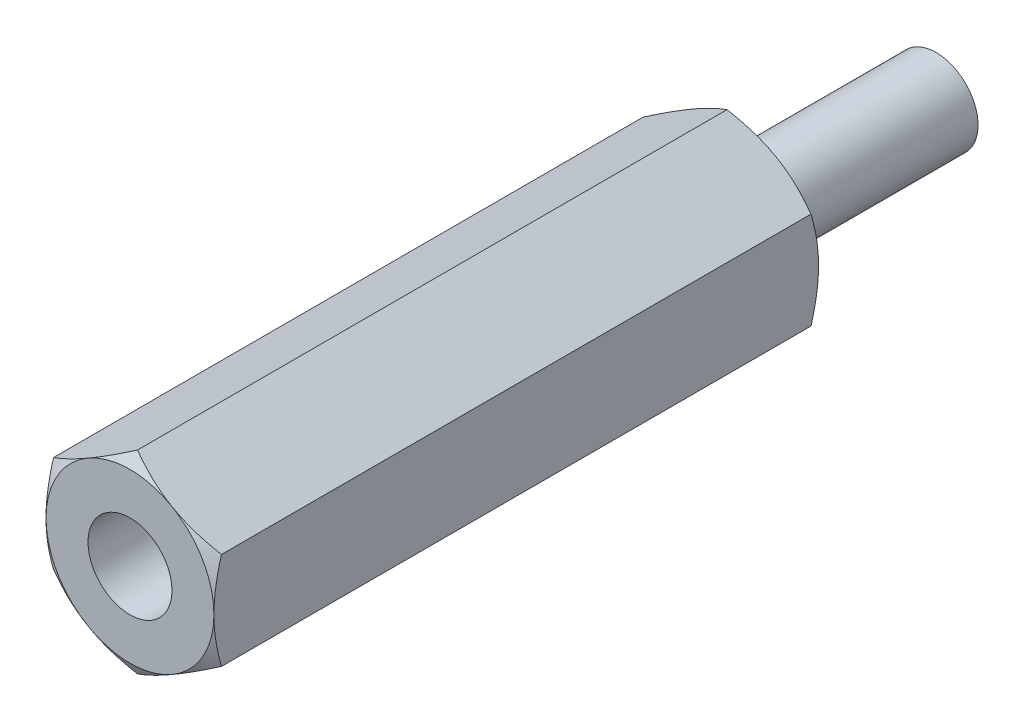
ISO-10303-21;
HEADER;
FILE_DESCRIPTION(('STEP AP214'),'2;1');
FILE_NAME('part.step','',(''),(''),'','','');
FILE_SCHEMA(('AUTOMOTIVE_DESIGN { 1 0 10303 214 1 1 1 1 }'));
ENDSEC;
DATA;
#1=APPLICATION_CONTEXT('core data for automotive mechanical design processes');
#2=APPLICATION_PROTOCOL_DEFINITION('international standard','automotive_design',2000,#1);
#3=PRODUCT_CONTEXT('',#1,'mechanical');
#4=PRODUCT('Part','Part','',(#3));
#5=PRODUCT_RELATED_PRODUCT_CATEGORY('part','',(#4));
#6=PRODUCT_DEFINITION_FORMATION('','',#4);
#7=PRODUCT_DEFINITION_CONTEXT('part definition',#1,'design');
#8=PRODUCT_DEFINITION('design','',#6,#7);
#9=PRODUCT_DEFINITION_SHAPE('','',#8);
#10=(LENGTH_UNIT() NAMED_UNIT(*) SI_UNIT(.MILLI.,.METRE.));
#11=(NAMED_UNIT(*) PLANE_ANGLE_UNIT() SI_UNIT($,.RADIAN.));
#12=(NAMED_UNIT(*) SI_UNIT($,.STERADIAN.) SOLID_ANGLE_UNIT());
#13=UNCERTAINTY_MEASURE_WITH_UNIT(LENGTH_MEASURE(1.E-05),#10,'distance_accuracy_value','');
#14=(GEOMETRIC_REPRESENTATION_CONTEXT(3) GLOBAL_UNCERTAINTY_ASSIGNED_CONTEXT((#13)) GLOBAL_UNIT_ASSIGNED_CONTEXT((#10,
#11,#12)) REPRESENTATION_CONTEXT('',''));
#15=CARTESIAN_POINT('',(0.,0.,0.));
#16=DIRECTION('',(0.,0.,1.));
#17=DIRECTION('',(1.,0.,0.));
#18=AXIS2_PLACEMENT_3D('',#15,#16,#17);
#19=CARTESIAN_POINT('',(0.,0.,9.));
#20=DIRECTION('',(0.,0.,1.));
#21=DIRECTION('',(1.,0.,0.));
#22=AXIS2_PLACEMENT_3D('',#19,#20,#21);
#23=PLANE('',#22);
#24=CARTESIAN_POINT('',(0.,0.,9.));
#25=DIRECTION('',(0.,0.,-1.));
#26=DIRECTION('',(1.,0.,0.));
#27=AXIS2_PLACEMENT_3D('',#24,#25,#26);
#28=CIRCLE('',#27,1.25);
#29=CARTESIAN_POINT('',(-1.25,0.,9.));
#30=VERTEX_POINT('',#29);
#31=EDGE_CURVE('P0_E238',#30,#30,#28,.T.);
#32=ORIENTED_EDGE('',*,*,#31,.T.);
#33=EDGE_LOOP('',(#32));
#34=FACE_BOUND('',#33,.T.);
#35=CARTESIAN_POINT('',(0.,0.,9.));
#36=DIRECTION('',(0.,0.,1.));
#37=DIRECTION('',(0.,1.,0.));
#38=AXIS2_PLACEMENT_3D('',#35,#36,#37);
#39=CIRCLE('',#38,2.5);
#40=CARTESIAN_POINT('',(1.25,2.1650635094611,9.));
#41=VERTEX_POINT('',#40);
#42=CARTESIAN_POINT('',(-1.25,2.1650635094611,9.));
#43=VERTEX_POINT('',#42);
#44=EDGE_CURVE('P0_E236',#41,#43,#39,.T.);
#45=ORIENTED_EDGE('',*,*,#44,.T.);
#46=CARTESIAN_POINT('',(0.,0.,9.));
#47=DIRECTION('',(0.,0.,1.));
#48=DIRECTION('',(0.,1.,0.));
#49=AXIS2_PLACEMENT_3D('',#46,#47,#48);
#50=CIRCLE('',#49,2.5);
#51=CARTESIAN_POINT('',(-2.5,0.,9.));
#52=VERTEX_POINT('',#51);
#53=EDGE_CURVE('P0_E180',#43,#52,#50,.T.);
#54=ORIENTED_EDGE('',*,*,#53,.T.);
#55=CARTESIAN_POINT('',(0.,0.,9.));
#56=DIRECTION('',(0.,0.,1.));
#57=DIRECTION('',(0.,1.,0.));
#58=AXIS2_PLACEMENT_3D('',#55,#56,#57);
#59=CIRCLE('',#58,2.5);
#60=CARTESIAN_POINT('',(-1.25,-2.1650635094611,9.));
#61=VERTEX_POINT('',#60);
#62=EDGE_CURVE('P0_E175',#52,#61,#59,.T.);
#63=ORIENTED_EDGE('',*,*,#62,.T.);
#64=CARTESIAN_POINT('',(0.,0.,9.));
#65=DIRECTION('',(0.,0.,1.));
#66=DIRECTION('',(0.,1.,0.));
#67=AXIS2_PLACEMENT_3D('',#64,#65,#66);
#68=CIRCLE('',#67,2.5);
#69=CARTESIAN_POINT('',(1.25,-2.1650635094611,9.));
#70=VERTEX_POINT('',#69);
#71=EDGE_CURVE('P0_E173',#61,#70,#68,.T.);
#72=ORIENTED_EDGE('',*,*,#71,.T.);
#73=CARTESIAN_POINT('',(0.,0.,9.));
#74=DIRECTION('',(0.,0.,1.));
#75=DIRECTION('',(0.,1.,0.));
#76=AXIS2_PLACEMENT_3D('',#73,#74,#75);
#77=CIRCLE('',#76,2.5);
#78=CARTESIAN_POINT('',(2.5,0.,9.));
#79=VERTEX_POINT('',#78);
#80=EDGE_CURVE('P0_E174',#70,#79,#77,.T.);
#81=ORIENTED_EDGE('',*,*,#80,.T.);
#82=CARTESIAN_POINT('',(0.,0.,9.));
#83=DIRECTION('',(0.,0.,1.));
#84=DIRECTION('',(0.,1.,0.));
#85=AXIS2_PLACEMENT_3D('',#82,#83,#84);
#86=CIRCLE('',#85,2.5);
#87=EDGE_CURVE('P0_E243',#79,#41,#86,.T.);
#88=ORIENTED_EDGE('',*,*,#87,.T.);
#89=EDGE_LOOP('',(#45,#54,#63,#72,#81,#88));
#90=FACE_BOUND('',#89,.T.);
#91=ADVANCED_FACE('P0_F17',(#34,#90),#23,.T.);
#92=CARTESIAN_POINT('',(-2.5,-1.44337567297406,0.));
#93=DIRECTION('',(-0.5,-0.866025403784439,0.));
#94=DIRECTION('',(-0.866025403784439,0.5,0.));
#95=AXIS2_PLACEMENT_3D('',#92,#93,#94);
#96=PLANE('',#95);
#97=CARTESIAN_POINT('',(-1.25,-2.1650635094611,-9.));
#98=CARTESIAN_POINT('',(-1.83012701892219,-1.83012701892219,-9.));
#99=CARTESIAN_POINT('',(-2.5,-1.44337567297406,-8.7767090063074));
#100=(BOUNDED_CURVE() B_SPLINE_CURVE(2,(#97,#98,#99),.UNSPECIFIED.,.F.,
.F.) B_SPLINE_CURVE_WITH_KNOTS((3,3),(0.736177037307537,0.963660383345878),
.UNSPECIFIED.) CURVE() GEOMETRIC_REPRESENTATION_ITEM() RATIONAL_B_SPLINE_CURVE((1.,
1.12214587875236,1.16880406420473)) REPRESENTATION_ITEM(''));
#101=CARTESIAN_POINT('',(-1.25,-2.1650635094611,-9.));
#102=VERTEX_POINT('',#101);
#103=CARTESIAN_POINT('',(-2.5,-1.44337567297406,-8.7767090063074));
#104=VERTEX_POINT('',#103);
#105=EDGE_CURVE('P0_E283',#102,#104,#100,.T.);
#106=ORIENTED_EDGE('',*,*,#105,.F.);
#107=CARTESIAN_POINT('',(0.,-2.88675134594813,-8.7767090063074));
#108=CARTESIAN_POINT('',(-0.669872981077806,-2.5,-9.));
#109=CARTESIAN_POINT('',(-1.25,-2.1650635094611,-9.));
#110=(BOUNDED_CURVE() B_SPLINE_CURVE(2,(#107,#108,#109),.UNSPECIFIED.,.F.,
.F.) B_SPLINE_CURVE_WITH_KNOTS((3,3),(0.527256351654248,0.757443789995707),
.UNSPECIFIED.) CURVE() GEOMETRIC_REPRESENTATION_ITEM() RATIONAL_B_SPLINE_CURVE((1.17255857963456,
1.12394675203494,1.)) REPRESENTATION_ITEM(''));
#111=CARTESIAN_POINT('',(0.,-2.88675134594813,-8.7767090063074));
#112=VERTEX_POINT('',#111);
#113=EDGE_CURVE('P0_E288',#112,#102,#110,.T.);
#114=ORIENTED_EDGE('',*,*,#113,.F.);
#115=DIRECTION('',(0.,0.,1.));
#116=VECTOR('',#115,1.);
#117=CARTESIAN_POINT('',(0.,-2.88675134594813,0.));
#118=LINE('',#117,#116);
#119=CARTESIAN_POINT('',(0.,-2.88675134594813,8.7767090063074));
#120=VERTEX_POINT('',#119);
#121=EDGE_CURVE('P0_E20',#112,#120,#118,.T.);
#122=ORIENTED_EDGE('',*,*,#121,.T.);
#123=CARTESIAN_POINT('',(0.,-2.88675134594813,8.7767090063074));
#124=CARTESIAN_POINT('',(-0.669872981076414,-2.5000000000008,8.99999999999922));
#125=CARTESIAN_POINT('',(-1.25,-2.1650635094611,9.));
#126=(BOUNDED_CURVE() B_SPLINE_CURVE(2,(#123,#124,#125),.UNSPECIFIED.,.F.,
.F.) B_SPLINE_CURVE_WITH_KNOTS((3,3),(0.658510081069826,0.907146244987517),
.UNSPECIFIED.) CURVE() GEOMETRIC_REPRESENTATION_ITEM() RATIONAL_B_SPLINE_CURVE((1.19657732070712,
1.13539988487303,1.)) REPRESENTATION_ITEM(''));
#127=EDGE_CURVE('P0_E164',#120,#61,#126,.T.);
#128=ORIENTED_EDGE('',*,*,#127,.T.);
#129=CARTESIAN_POINT('',(-1.25,-2.1650635094611,9.));
#130=CARTESIAN_POINT('',(-1.83012701892359,-1.83012701892139,8.99999999999922));
#131=CARTESIAN_POINT('',(-2.5,-1.44337567297406,8.7767090063074));
#132=(BOUNDED_CURVE() B_SPLINE_CURVE(2,(#129,#130,#131),.UNSPECIFIED.,.F.,
.F.) B_SPLINE_CURVE_WITH_KNOTS((3,3),(0.907146244987517,1.15578240890521),
.UNSPECIFIED.) CURVE() GEOMETRIC_REPRESENTATION_ITEM() RATIONAL_B_SPLINE_CURVE((1.,
1.13539988487303,1.19657732070712)) REPRESENTATION_ITEM(''));
#133=CARTESIAN_POINT('',(-2.5,-1.44337567297406,8.7767090063074));
#134=VERTEX_POINT('',#133);
#135=EDGE_CURVE('P0_E181',#61,#134,#132,.T.);
#136=ORIENTED_EDGE('',*,*,#135,.T.);
#137=DIRECTION('',(0.,0.,1.));
#138=VECTOR('',#137,1.);
#139=CARTESIAN_POINT('',(-2.5,-1.44337567297406,0.));
#140=LINE('',#139,#138);
#141=EDGE_CURVE('P0_E294',#104,#134,#140,.T.);
#142=ORIENTED_EDGE('',*,*,#141,.F.);
#143=EDGE_LOOP('',(#106,#114,#122,#128,#136,#142));
#144=FACE_BOUND('',#143,.T.);
#145=ADVANCED_FACE('P0_F473',(#144),#96,.T.);
#146=CARTESIAN_POINT('',(0.,0.,-1.));
#147=DIRECTION('',(0.,0.,1.));
#148=DIRECTION('',(1.,0.,0.));
#149=AXIS2_PLACEMENT_3D('',#146,#147,#148);
#150=PLANE('',#149);
#151=CARTESIAN_POINT('',(0.,0.,-1.));
#152=DIRECTION('',(0.,0.,-1.));
#153=DIRECTION('',(1.,0.,0.));
#154=AXIS2_PLACEMENT_3D('',#151,#152,#153);
#155=CIRCLE('',#154,1.25);
#156=CARTESIAN_POINT('',(-1.25,0.,-1.));
#157=VERTEX_POINT('',#156);
#158=EDGE_CURVE('P0_E11',#157,#157,#155,.T.);
#159=ORIENTED_EDGE('',*,*,#158,.F.);
#160=EDGE_LOOP('',(#159));
#161=FACE_BOUND('',#160,.T.);
#162=ADVANCED_FACE('P0_F546',(#161),#150,.T.);
#163=CARTESIAN_POINT('',(0.,0.,9.));
#164=DIRECTION('',(0.,0.,-1.));
#165=DIRECTION('',(1.,0.,0.));
#166=AXIS2_PLACEMENT_3D('',#163,#164,#165);
#167=CYLINDRICAL_SURFACE('',#166,1.25);
#168=ORIENTED_EDGE('',*,*,#31,.F.);
#169=DIRECTION('',(0.,0.,-1.));
#170=VECTOR('',#169,1.);
#171=CARTESIAN_POINT('',(-1.25,0.,9.));
#172=LINE('',#171,#170);
#173=EDGE_CURVE('P0_E27',#30,#157,#172,.T.);
#174=ORIENTED_EDGE('',*,*,#173,.T.);
#175=ORIENTED_EDGE('',*,*,#158,.T.);
#176=ORIENTED_EDGE('',*,*,#173,.F.);
#177=EDGE_LOOP('',(#168,#174,#175,#176));
#178=FACE_BOUND('',#177,.T.);
#179=ADVANCED_FACE('P0_F549',(#178),#167,.F.);
#180=CARTESIAN_POINT('',(0.,0.,7.22168783648703));
#181=DIRECTION('',(0.,0.,-1.));
#182=DIRECTION('',(0.,1.,0.));
#183=AXIS2_PLACEMENT_3D('',#180,#181,#182);
#184=CONICAL_SURFACE('',#183,5.58012701892219,1.0471975511966);
#185=CARTESIAN_POINT('',(-1.25,2.1650635094611,9.));
#186=CARTESIAN_POINT('',(-0.669872981076411,2.50000000000081,8.99999999999922));
#187=CARTESIAN_POINT('',(0.,2.88675134594813,8.7767090063074));
#188=(BOUNDED_CURVE() B_SPLINE_CURVE(2,(#185,#186,#187),.UNSPECIFIED.,.F.,
.F.) B_SPLINE_CURVE_WITH_KNOTS((3,3),(0.907146244987517,1.15578240890521),
.UNSPECIFIED.) CURVE() GEOMETRIC_REPRESENTATION_ITEM() RATIONAL_B_SPLINE_CURVE((1.,
1.13539988487303,1.19657732070712)) REPRESENTATION_ITEM(''));
#189=CARTESIAN_POINT('',(0.,2.88675134594813,8.7767090063074));
#190=VERTEX_POINT('',#189);
#191=EDGE_CURVE('P0_E187',#43,#190,#188,.T.);
#192=ORIENTED_EDGE('',*,*,#191,.F.);
#193=ORIENTED_EDGE('',*,*,#44,.F.);
#194=CARTESIAN_POINT('',(0.,2.88675134594813,8.7767090063074));
#195=CARTESIAN_POINT('',(0.669872981076414,2.5000000000008,8.99999999999922));
#196=CARTESIAN_POINT('',(1.25,2.1650635094611,9.));
#197=(BOUNDED_CURVE() B_SPLINE_CURVE(2,(#194,#195,#196),.UNSPECIFIED.,.F.,
.F.) B_SPLINE_CURVE_WITH_KNOTS((3,3),(0.658510081069826,0.907146244987517),
.UNSPECIFIED.) CURVE() GEOMETRIC_REPRESENTATION_ITEM() RATIONAL_B_SPLINE_CURVE((1.19657732070712,
1.13539988487303,1.)) REPRESENTATION_ITEM(''));
#198=EDGE_CURVE('P0_E252',#190,#41,#197,.T.);
#199=ORIENTED_EDGE('',*,*,#198,.F.);
#200=EDGE_LOOP('',(#192,#193,#199));
#201=FACE_BOUND('',#200,.T.);
#202=ADVANCED_FACE('P0_F421',(#201),#184,.T.);
#203=CARTESIAN_POINT('',(0.,0.,7.22168783648703));
#204=DIRECTION('',(0.,0.,-1.));
#205=DIRECTION('',(0.,1.,0.));
#206=AXIS2_PLACEMENT_3D('',#203,#204,#205);
#207=CONICAL_SURFACE('',#206,5.58012701892219,1.0471975511966);
#208=CARTESIAN_POINT('',(-2.5,0.,9.));
#209=CARTESIAN_POINT('',(-2.5,0.66987298107942,8.99999999999922));
#210=CARTESIAN_POINT('',(-2.5,1.44337567297406,8.7767090063074));
#211=(BOUNDED_CURVE() B_SPLINE_CURVE(2,(#208,#209,#210),.UNSPECIFIED.,.F.,
.F.) B_SPLINE_CURVE_WITH_KNOTS((3,3),(0.907146244987517,1.15578240890521),
.UNSPECIFIED.) CURVE() GEOMETRIC_REPRESENTATION_ITEM() RATIONAL_B_SPLINE_CURVE((1.,
1.13539988487303,1.19657732070712)) REPRESENTATION_ITEM(''));
#212=CARTESIAN_POINT('',(-2.5,1.44337567297406,8.7767090063074));
#213=VERTEX_POINT('',#212);
#214=EDGE_CURVE('P0_E118',#52,#213,#211,.T.);
#215=ORIENTED_EDGE('',*,*,#214,.F.);
#216=ORIENTED_EDGE('',*,*,#53,.F.);
#217=CARTESIAN_POINT('',(-2.5,1.44337567297406,8.7767090063074));
#218=CARTESIAN_POINT('',(-1.83012701892359,1.83012701892139,8.99999999999922));
#219=CARTESIAN_POINT('',(-1.25,2.1650635094611,9.));
#220=(BOUNDED_CURVE() B_SPLINE_CURVE(2,(#217,#218,#219),.UNSPECIFIED.,.F.,
.F.) B_SPLINE_CURVE_WITH_KNOTS((3,3),(0.658510081069828,0.907146244987517),
.UNSPECIFIED.) CURVE() GEOMETRIC_REPRESENTATION_ITEM() RATIONAL_B_SPLINE_CURVE((1.19657732070712,
1.13539988487303,1.)) REPRESENTATION_ITEM(''));
#221=EDGE_CURVE('P0_E123',#213,#43,#220,.T.);
#222=ORIENTED_EDGE('',*,*,#221,.F.);
#223=EDGE_LOOP('',(#215,#216,#222));
#224=FACE_BOUND('',#223,.T.);
#225=ADVANCED_FACE('P0_F423',(#224),#207,.T.);
#226=CARTESIAN_POINT('',(0.,0.,7.22168783648703));
#227=DIRECTION('',(0.,0.,-1.));
#228=DIRECTION('',(0.,1.,0.));
#229=AXIS2_PLACEMENT_3D('',#226,#227,#228);
#230=CONICAL_SURFACE('',#229,5.58012701892219,1.0471975511966);
#231=ORIENTED_EDGE('',*,*,#135,.F.);
#232=ORIENTED_EDGE('',*,*,#62,.F.);
#233=CARTESIAN_POINT('',(-2.5,-1.44337567297406,8.7767090063074));
#234=CARTESIAN_POINT('',(-2.5,-0.669872981079411,8.99999999999923));
#235=CARTESIAN_POINT('',(-2.5,0.,9.));
#236=(BOUNDED_CURVE() B_SPLINE_CURVE(2,(#233,#234,#235),.UNSPECIFIED.,.F.,
.F.) B_SPLINE_CURVE_WITH_KNOTS((3,3),(0.658510081069825,0.907146244987517),
.UNSPECIFIED.) CURVE() GEOMETRIC_REPRESENTATION_ITEM() RATIONAL_B_SPLINE_CURVE((1.19657732070712,
1.13539988487303,1.)) REPRESENTATION_ITEM(''));
#237=EDGE_CURVE('P0_E298',#134,#52,#236,.T.);
#238=ORIENTED_EDGE('',*,*,#237,.F.);
#239=EDGE_LOOP('',(#231,#232,#238));
#240=FACE_BOUND('',#239,.T.);
#241=ADVANCED_FACE('P0_F561',(#240),#230,.T.);
#242=CARTESIAN_POINT('',(0.,0.,7.22168783648703));
#243=DIRECTION('',(0.,0.,-1.));
#244=DIRECTION('',(0.,-1.,0.));
#245=AXIS2_PLACEMENT_3D('',#242,#243,#244);
#246=CONICAL_SURFACE('',#245,5.58012701892219,1.0471975511966);
#247=ORIENTED_EDGE('',*,*,#127,.F.);
#248=CARTESIAN_POINT('',(1.25,-2.1650635094611,9.));
#249=CARTESIAN_POINT('',(0.669872981076411,-2.50000000000081,8.99999999999922));
#250=CARTESIAN_POINT('',(0.,-2.88675134594813,8.7767090063074));
#251=(BOUNDED_CURVE() B_SPLINE_CURVE(2,(#248,#249,#250),.UNSPECIFIED.,.F.,
.F.) B_SPLINE_CURVE_WITH_KNOTS((3,3),(0.907146244987517,1.15578240890521),
.UNSPECIFIED.) CURVE() GEOMETRIC_REPRESENTATION_ITEM() RATIONAL_B_SPLINE_CURVE((1.,
1.13539988487303,1.19657732070712)) REPRESENTATION_ITEM(''));
#252=EDGE_CURVE('P0_E196',#70,#120,#251,.T.);
#253=ORIENTED_EDGE('',*,*,#252,.F.);
#254=ORIENTED_EDGE('',*,*,#71,.F.);
#255=EDGE_LOOP('',(#247,#253,#254));
#256=FACE_BOUND('',#255,.T.);
#257=ADVANCED_FACE('P0_F562',(#256),#246,.T.);
#258=CARTESIAN_POINT('',(0.,0.,7.22168783648703));
#259=DIRECTION('',(0.,0.,-1.));
#260=DIRECTION('',(0.,1.,0.));
#261=AXIS2_PLACEMENT_3D('',#258,#259,#260);
#262=CONICAL_SURFACE('',#261,5.58012701892219,1.0471975511966);
#263=CARTESIAN_POINT('',(2.5,-1.44337567297406,8.7767090063074));
#264=CARTESIAN_POINT('',(1.83012701892359,-1.83012701892139,8.99999999999922));
#265=CARTESIAN_POINT('',(1.25,-2.1650635094611,9.));
#266=(BOUNDED_CURVE() B_SPLINE_CURVE(2,(#263,#264,#265),.UNSPECIFIED.,.F.,
.F.) B_SPLINE_CURVE_WITH_KNOTS((3,3),(0.658510081069828,0.907146244987517),
.UNSPECIFIED.) CURVE() GEOMETRIC_REPRESENTATION_ITEM() RATIONAL_B_SPLINE_CURVE((1.19657732070712,
1.13539988487303,1.)) REPRESENTATION_ITEM(''));
#267=CARTESIAN_POINT('',(2.5,-1.44337567297406,8.7767090063074));
#268=VERTEX_POINT('',#267);
#269=EDGE_CURVE('P0_E188',#268,#70,#266,.T.);
#270=ORIENTED_EDGE('',*,*,#269,.F.);
#271=CARTESIAN_POINT('',(2.5,0.,9.));
#272=CARTESIAN_POINT('',(2.5,-0.66987298107942,8.99999999999922));
#273=CARTESIAN_POINT('',(2.5,-1.44337567297406,8.7767090063074));
#274=(BOUNDED_CURVE() B_SPLINE_CURVE(2,(#271,#272,#273),.UNSPECIFIED.,.F.,
.F.) B_SPLINE_CURVE_WITH_KNOTS((3,3),(0.907146244987517,1.15578240890521),
.UNSPECIFIED.) CURVE() GEOMETRIC_REPRESENTATION_ITEM() RATIONAL_B_SPLINE_CURVE((1.,
1.13539988487303,1.19657732070712)) REPRESENTATION_ITEM(''));
#275=EDGE_CURVE('P0_E220',#79,#268,#274,.T.);
#276=ORIENTED_EDGE('',*,*,#275,.F.);
#277=ORIENTED_EDGE('',*,*,#80,.F.);
#278=EDGE_LOOP('',(#270,#276,#277));
#279=FACE_BOUND('',#278,.T.);
#280=ADVANCED_FACE('P0_F362',(#279),#262,.T.);
#281=CARTESIAN_POINT('',(0.,0.,7.22168783648703));
#282=DIRECTION('',(0.,0.,-1.));
#283=DIRECTION('',(0.,1.,0.));
#284=AXIS2_PLACEMENT_3D('',#281,#282,#283);
#285=CONICAL_SURFACE('',#284,5.58012701892219,1.0471975511966);
#286=CARTESIAN_POINT('',(2.5,1.44337567297406,8.7767090063074));
#287=CARTESIAN_POINT('',(2.5,0.669872981079411,8.99999999999923));
#288=CARTESIAN_POINT('',(2.5,0.,9.));
#289=(BOUNDED_CURVE() B_SPLINE_CURVE(2,(#286,#287,#288),.UNSPECIFIED.,.F.,
.F.) B_SPLINE_CURVE_WITH_KNOTS((3,3),(0.658510081069825,0.907146244987517),
.UNSPECIFIED.) CURVE() GEOMETRIC_REPRESENTATION_ITEM() RATIONAL_B_SPLINE_CURVE((1.19657732070712,
1.13539988487303,1.)) REPRESENTATION_ITEM(''));
#290=CARTESIAN_POINT('',(2.5,1.44337567297406,8.7767090063074));
#291=VERTEX_POINT('',#290);
#292=EDGE_CURVE('P0_E211',#291,#79,#289,.T.);
#293=ORIENTED_EDGE('',*,*,#292,.F.);
#294=CARTESIAN_POINT('',(1.25,2.1650635094611,9.));
#295=CARTESIAN_POINT('',(1.83012701892359,1.83012701892139,8.99999999999922));
#296=CARTESIAN_POINT('',(2.5,1.44337567297406,8.7767090063074));
#297=(BOUNDED_CURVE() B_SPLINE_CURVE(2,(#294,#295,#296),.UNSPECIFIED.,.F.,
.F.) B_SPLINE_CURVE_WITH_KNOTS((3,3),(0.907146244987517,1.15578240890521),
.UNSPECIFIED.) CURVE() GEOMETRIC_REPRESENTATION_ITEM() RATIONAL_B_SPLINE_CURVE((1.,
1.13539988487303,1.19657732070712)) REPRESENTATION_ITEM(''));
#298=EDGE_CURVE('P0_E258',#41,#291,#297,.T.);
#299=ORIENTED_EDGE('',*,*,#298,.F.);
#300=ORIENTED_EDGE('',*,*,#87,.F.);
#301=EDGE_LOOP('',(#293,#299,#300));
#302=FACE_BOUND('',#301,.T.);
#303=ADVANCED_FACE('P0_F415',(#302),#285,.T.);
#304=CARTESIAN_POINT('',(0.,0.,-7.22168783648703));
#305=DIRECTION('',(0.,0.,1.));
#306=DIRECTION('',(0.,1.,0.));
#307=AXIS2_PLACEMENT_3D('',#304,#305,#306);
#308=CONICAL_SURFACE('',#307,5.58012701892219,1.0471975511966);
#309=CARTESIAN_POINT('',(2.5,1.44337567297406,-8.7767090063074));
#310=CARTESIAN_POINT('',(2.5,0.669872981077806,-8.99999999999999));
#311=CARTESIAN_POINT('',(2.5,0.,-9.));
#312=(BOUNDED_CURVE() B_SPLINE_CURVE(2,(#309,#310,#311),.UNSPECIFIED.,.F.,
.F.) B_SPLINE_CURVE_WITH_KNOTS((3,3),(0.508693691269196,0.736177037307537),
.UNSPECIFIED.) CURVE() GEOMETRIC_REPRESENTATION_ITEM() RATIONAL_B_SPLINE_CURVE((1.16880406420473,
1.12214587875235,1.)) REPRESENTATION_ITEM(''));
#313=CARTESIAN_POINT('',(2.5,1.44337567297406,-8.7767090063074));
#314=VERTEX_POINT('',#313);
#315=CARTESIAN_POINT('',(2.5,0.,-9.));
#316=VERTEX_POINT('',#315);
#317=EDGE_CURVE('P0_E221',#314,#316,#312,.T.);
#318=ORIENTED_EDGE('',*,*,#317,.T.);
#319=CARTESIAN_POINT('',(0.,0.,-9.));
#320=DIRECTION('',(0.,0.,1.));
#321=DIRECTION('',(0.,1.,0.));
#322=AXIS2_PLACEMENT_3D('',#319,#320,#321);
#323=CIRCLE('',#322,2.5);
#324=CARTESIAN_POINT('',(1.25,2.1650635094611,-9.));
#325=VERTEX_POINT('',#324);
#326=EDGE_CURVE('P0_E299',#316,#325,#323,.T.);
#327=ORIENTED_EDGE('',*,*,#326,.T.);
#328=CARTESIAN_POINT('',(1.25,2.1650635094611,-9.));
#329=CARTESIAN_POINT('',(1.83012701892219,1.83012701892219,-9.));
#330=CARTESIAN_POINT('',(2.5,1.44337567297406,-8.7767090063074));
#331=(BOUNDED_CURVE() B_SPLINE_CURVE(2,(#328,#329,#330),.UNSPECIFIED.,.F.,
.F.) B_SPLINE_CURVE_WITH_KNOTS((3,3),(0.736177037307537,0.963660383345878),
.UNSPECIFIED.) CURVE() GEOMETRIC_REPRESENTATION_ITEM() RATIONAL_B_SPLINE_CURVE((1.,
1.12214587875236,1.16880406420473)) REPRESENTATION_ITEM(''));
#332=EDGE_CURVE('P0_E289',#325,#314,#331,.T.);
#333=ORIENTED_EDGE('',*,*,#332,.T.);
#334=EDGE_LOOP('',(#318,#327,#333));
#335=FACE_BOUND('',#334,.T.);
#336=ADVANCED_FACE('P0_F481',(#335),#308,.T.);
#337=CARTESIAN_POINT('',(2.5,-1.44337567297406,0.));
#338=DIRECTION('',(1.,0.,0.));
#339=DIRECTION('',(0.,1.,0.));
#340=AXIS2_PLACEMENT_3D('',#337,#338,#339);
#341=PLANE('',#340);
#342=CARTESIAN_POINT('',(2.5,0.,-9.));
#343=CARTESIAN_POINT('',(2.5,-0.669872981077805,-8.99999999999999));
#344=CARTESIAN_POINT('',(2.5,-1.44337567297406,-8.7767090063074));
#345=(BOUNDED_CURVE() B_SPLINE_CURVE(2,(#342,#343,#344),.UNSPECIFIED.,.F.,
.F.) B_SPLINE_CURVE_WITH_KNOTS((3,3),(0.736177037307537,0.963660383345878),
.UNSPECIFIED.) CURVE() GEOMETRIC_REPRESENTATION_ITEM() RATIONAL_B_SPLINE_CURVE((1.,
1.12214587875235,1.16880406420473)) REPRESENTATION_ITEM(''));
#346=CARTESIAN_POINT('',(2.5,-1.44337567297406,-8.7767090063074));
#347=VERTEX_POINT('',#346);
#348=EDGE_CURVE('P0_E259',#316,#347,#345,.T.);
#349=ORIENTED_EDGE('',*,*,#348,.F.);
#350=ORIENTED_EDGE('',*,*,#317,.F.);
#351=DIRECTION('',(0.,0.,1.));
#352=VECTOR('',#351,1.);
#353=CARTESIAN_POINT('',(2.5,1.44337567297406,0.));
#354=LINE('',#353,#352);
#355=EDGE_CURVE('P0_E317',#314,#291,#354,.T.);
#356=ORIENTED_EDGE('',*,*,#355,.T.);
#357=ORIENTED_EDGE('',*,*,#292,.T.);
#358=ORIENTED_EDGE('',*,*,#275,.T.);
#359=DIRECTION('',(0.,0.,-1.));
#360=VECTOR('',#359,1.);
#361=CARTESIAN_POINT('',(2.5,-1.44337567297406,0.));
#362=LINE('',#361,#360);
#363=EDGE_CURVE('P0_E155',#268,#347,#362,.T.);
#364=ORIENTED_EDGE('',*,*,#363,.T.);
#365=EDGE_LOOP('',(#349,#350,#356,#357,#358,#364));
#366=FACE_BOUND('',#365,.T.);
#367=ADVANCED_FACE('P0_F354',(#366),#341,.T.);
#368=CARTESIAN_POINT('',(0.,0.,-7.22168783648703));
#369=DIRECTION('',(0.,0.,1.));
#370=DIRECTION('',(0.,1.,0.));
#371=AXIS2_PLACEMENT_3D('',#368,#369,#370);
#372=CONICAL_SURFACE('',#371,5.58012701892219,1.0471975511966);
#373=CARTESIAN_POINT('',(2.5,-1.44337567297406,-8.7767090063074));
#374=CARTESIAN_POINT('',(1.83012701892219,-1.83012701892219,-9.));
#375=CARTESIAN_POINT('',(1.25,-2.1650635094611,-9.));
#376=(BOUNDED_CURVE() B_SPLINE_CURVE(2,(#373,#374,#375),.UNSPECIFIED.,.F.,
.F.) B_SPLINE_CURVE_WITH_KNOTS((3,3),(0.508693691269197,0.736177037307537),
.UNSPECIFIED.) CURVE() GEOMETRIC_REPRESENTATION_ITEM() RATIONAL_B_SPLINE_CURVE((1.16880406420473,
1.12214587875236,1.)) REPRESENTATION_ITEM(''));
#377=CARTESIAN_POINT('',(1.25,-2.1650635094611,-9.));
#378=VERTEX_POINT('',#377);
#379=EDGE_CURVE('P0_E146',#347,#378,#376,.T.);
#380=ORIENTED_EDGE('',*,*,#379,.T.);
#381=CARTESIAN_POINT('',(0.,0.,-9.));
#382=DIRECTION('',(0.,0.,1.));
#383=DIRECTION('',(0.,1.,0.));
#384=AXIS2_PLACEMENT_3D('',#381,#382,#383);
#385=CIRCLE('',#384,2.5);
#386=EDGE_CURVE('P0_E251',#378,#316,#385,.T.);
#387=ORIENTED_EDGE('',*,*,#386,.T.);
#388=ORIENTED_EDGE('',*,*,#348,.T.);
#389=EDGE_LOOP('',(#380,#387,#388));
#390=FACE_BOUND('',#389,.T.);
#391=ADVANCED_FACE('P0_F371',(#390),#372,.T.);
#392=CARTESIAN_POINT('',(0.,-2.88675134594813,0.));
#393=DIRECTION('',(0.5,-0.866025403784439,0.));
#394=DIRECTION('',(0.,0.,-1.));
#395=AXIS2_PLACEMENT_3D('',#392,#393,#394);
#396=PLANE('',#395);
#397=CARTESIAN_POINT('',(1.25,-2.1650635094611,-9.));
#398=CARTESIAN_POINT('',(0.669872981077805,-2.5,-9.));
#399=CARTESIAN_POINT('',(0.,-2.88675134594813,-8.7767090063074));
#400=(BOUNDED_CURVE() B_SPLINE_CURVE(2,(#397,#398,#399),.UNSPECIFIED.,.F.,
.F.) B_SPLINE_CURVE_WITH_KNOTS((3,3),(0.757443789995707,0.987631228337167),
.UNSPECIFIED.) CURVE() GEOMETRIC_REPRESENTATION_ITEM() RATIONAL_B_SPLINE_CURVE((1.,
1.12394675203494,1.17255857963456)) REPRESENTATION_ITEM(''));
#401=EDGE_CURVE('P0_E156',#378,#112,#400,.T.);
#402=ORIENTED_EDGE('',*,*,#401,.F.);
#403=ORIENTED_EDGE('',*,*,#379,.F.);
#404=ORIENTED_EDGE('',*,*,#363,.F.);
#405=ORIENTED_EDGE('',*,*,#269,.T.);
#406=ORIENTED_EDGE('',*,*,#252,.T.);
#407=ORIENTED_EDGE('',*,*,#121,.F.);
#408=EDGE_LOOP('',(#402,#403,#404,#405,#406,#407));
#409=FACE_BOUND('',#408,.T.);
#410=ADVANCED_FACE('P0_F366',(#409),#396,.T.);
#411=CARTESIAN_POINT('',(0.,0.,-7.22168783648703));
#412=DIRECTION('',(0.,0.,1.));
#413=DIRECTION('',(0.,-1.,0.));
#414=AXIS2_PLACEMENT_3D('',#411,#412,#413);
#415=CONICAL_SURFACE('',#414,5.58012701892219,1.0471975511966);
#416=ORIENTED_EDGE('',*,*,#113,.T.);
#417=CARTESIAN_POINT('',(0.,0.,-9.));
#418=DIRECTION('',(0.,0.,1.));
#419=DIRECTION('',(0.,1.,0.));
#420=AXIS2_PLACEMENT_3D('',#417,#418,#419);
#421=CIRCLE('',#420,2.5);
#422=EDGE_CURVE('P0_E247',#102,#378,#421,.T.);
#423=ORIENTED_EDGE('',*,*,#422,.T.);
#424=ORIENTED_EDGE('',*,*,#401,.T.);
#425=EDGE_LOOP('',(#416,#423,#424));
#426=FACE_BOUND('',#425,.T.);
#427=ADVANCED_FACE('P0_F468',(#426),#415,.T.);
#428=CARTESIAN_POINT('',(0.,0.,-7.22168783648703));
#429=DIRECTION('',(0.,0.,1.));
#430=DIRECTION('',(0.,1.,0.));
#431=AXIS2_PLACEMENT_3D('',#428,#429,#430);
#432=CONICAL_SURFACE('',#431,5.58012701892219,1.0471975511966);
#433=ORIENTED_EDGE('',*,*,#105,.T.);
#434=CARTESIAN_POINT('',(-2.5,-1.44337567297406,-8.7767090063074));
#435=CARTESIAN_POINT('',(-2.5,-0.669872981077806,-8.99999999999999));
#436=CARTESIAN_POINT('',(-2.5,0.,-9.));
#437=(BOUNDED_CURVE() B_SPLINE_CURVE(2,(#434,#435,#436),.UNSPECIFIED.,.F.,
.F.) B_SPLINE_CURVE_WITH_KNOTS((3,3),(0.508693691269196,0.736177037307537),
.UNSPECIFIED.) CURVE() GEOMETRIC_REPRESENTATION_ITEM() RATIONAL_B_SPLINE_CURVE((1.16880406420473,
1.12214587875235,1.)) REPRESENTATION_ITEM(''));
#438=CARTESIAN_POINT('',(-2.5,0.,-9.));
#439=VERTEX_POINT('',#438);
#440=EDGE_CURVE('P0_E111',#104,#439,#437,.T.);
#441=ORIENTED_EDGE('',*,*,#440,.T.);
#442=CARTESIAN_POINT('',(0.,0.,-9.));
#443=DIRECTION('',(0.,0.,1.));
#444=DIRECTION('',(0.,1.,0.));
#445=AXIS2_PLACEMENT_3D('',#442,#443,#444);
#446=CIRCLE('',#445,2.5);
#447=EDGE_CURVE('P0_E246',#439,#102,#446,.T.);
#448=ORIENTED_EDGE('',*,*,#447,.T.);
#449=EDGE_LOOP('',(#433,#441,#448));
#450=FACE_BOUND('',#449,.T.);
#451=ADVANCED_FACE('P0_F475',(#450),#432,.T.);
#452=CARTESIAN_POINT('',(2.5,1.44337567297406,0.));
#453=DIRECTION('',(0.5,0.866025403784439,0.));
#454=DIRECTION('',(0.,0.,-1.));
#455=AXIS2_PLACEMENT_3D('',#452,#453,#454);
#456=PLANE('',#455);
#457=CARTESIAN_POINT('',(0.,2.88675134594813,-8.7767090063074));
#458=CARTESIAN_POINT('',(0.669872981077806,2.5,-9.));
#459=CARTESIAN_POINT('',(1.25,2.1650635094611,-9.));
#460=(BOUNDED_CURVE() B_SPLINE_CURVE(2,(#457,#458,#459),.UNSPECIFIED.,.F.,
.F.) B_SPLINE_CURVE_WITH_KNOTS((3,3),(0.527256351654248,0.757443789995707),
.UNSPECIFIED.) CURVE() GEOMETRIC_REPRESENTATION_ITEM() RATIONAL_B_SPLINE_CURVE((1.17255857963456,
1.12394675203494,1.)) REPRESENTATION_ITEM(''));
#461=CARTESIAN_POINT('',(0.,2.88675134594813,-8.7767090063074));
#462=VERTEX_POINT('',#461);
#463=EDGE_CURVE('P0_E137',#462,#325,#460,.T.);
#464=ORIENTED_EDGE('',*,*,#463,.F.);
#465=DIRECTION('',(0.,0.,1.));
#466=VECTOR('',#465,1.);
#467=CARTESIAN_POINT('',(0.,2.88675134594813,0.));
#468=LINE('',#467,#466);
#469=EDGE_CURVE('P0_E230',#462,#190,#468,.T.);
#470=ORIENTED_EDGE('',*,*,#469,.T.);
#471=ORIENTED_EDGE('',*,*,#198,.T.);
#472=ORIENTED_EDGE('',*,*,#298,.T.);
#473=ORIENTED_EDGE('',*,*,#355,.F.);
#474=ORIENTED_EDGE('',*,*,#332,.F.);
#475=EDGE_LOOP('',(#464,#470,#471,#472,#473,#474));
#476=FACE_BOUND('',#475,.T.);
#477=ADVANCED_FACE('P0_F420',(#476),#456,.T.);
#478=CARTESIAN_POINT('',(-2.5,1.44337567297406,0.));
#479=DIRECTION('',(-1.,0.,0.));
#480=DIRECTION('',(0.,0.,1.));
#481=AXIS2_PLACEMENT_3D('',#478,#479,#480);
#482=PLANE('',#481);
#483=CARTESIAN_POINT('',(-2.5,0.,-9.));
#484=CARTESIAN_POINT('',(-2.5,0.669872981077805,-8.99999999999999));
#485=CARTESIAN_POINT('',(-2.5,1.44337567297406,-8.7767090063074));
#486=(BOUNDED_CURVE() B_SPLINE_CURVE(2,(#483,#484,#485),.UNSPECIFIED.,.F.,
.F.) B_SPLINE_CURVE_WITH_KNOTS((3,3),(0.736177037307537,0.963660383345878),
.UNSPECIFIED.) CURVE() GEOMETRIC_REPRESENTATION_ITEM() RATIONAL_B_SPLINE_CURVE((1.,
1.12214587875235,1.16880406420473)) REPRESENTATION_ITEM(''));
#487=CARTESIAN_POINT('',(-2.5,1.44337567297406,-8.7767090063074));
#488=VERTEX_POINT('',#487);
#489=EDGE_CURVE('P0_E100',#439,#488,#486,.T.);
#490=ORIENTED_EDGE('',*,*,#489,.F.);
#491=ORIENTED_EDGE('',*,*,#440,.F.);
#492=ORIENTED_EDGE('',*,*,#141,.T.);
#493=ORIENTED_EDGE('',*,*,#237,.T.);
#494=ORIENTED_EDGE('',*,*,#214,.T.);
#495=DIRECTION('',(0.,0.,1.));
#496=VECTOR('',#495,1.);
#497=CARTESIAN_POINT('',(-2.5,1.44337567297406,0.));
#498=LINE('',#497,#496);
#499=EDGE_CURVE('P0_E114',#488,#213,#498,.T.);
#500=ORIENTED_EDGE('',*,*,#499,.F.);
#501=EDGE_LOOP('',(#490,#491,#492,#493,#494,#500));
#502=FACE_BOUND('',#501,.T.);
#503=ADVANCED_FACE('P0_F115',(#502),#482,.T.);
#504=CARTESIAN_POINT('',(0.,0.,-7.22168783648703));
#505=DIRECTION('',(0.,0.,1.));
#506=DIRECTION('',(0.,1.,0.));
#507=AXIS2_PLACEMENT_3D('',#504,#505,#506);
#508=CONICAL_SURFACE('',#507,5.58012701892219,1.0471975511966);
#509=ORIENTED_EDGE('',*,*,#489,.T.);
#510=CARTESIAN_POINT('',(-2.5,1.44337567297406,-8.7767090063074));
#511=CARTESIAN_POINT('',(-1.83012701892219,1.83012701892219,-8.99999999999999));
#512=CARTESIAN_POINT('',(-1.25,2.1650635094611,-9.));
#513=(BOUNDED_CURVE() B_SPLINE_CURVE(2,(#510,#511,#512),.UNSPECIFIED.,.F.,
.F.) B_SPLINE_CURVE_WITH_KNOTS((3,3),(0.508693691269197,0.736177037307537),
.UNSPECIFIED.) CURVE() GEOMETRIC_REPRESENTATION_ITEM() RATIONAL_B_SPLINE_CURVE((1.16880406420473,
1.12214587875235,1.)) REPRESENTATION_ITEM(''));
#514=CARTESIAN_POINT('',(-1.25,2.1650635094611,-9.));
#515=VERTEX_POINT('',#514);
#516=EDGE_CURVE('P0_E104',#488,#515,#513,.T.);
#517=ORIENTED_EDGE('',*,*,#516,.T.);
#518=CARTESIAN_POINT('',(0.,0.,-9.));
#519=DIRECTION('',(0.,0.,1.));
#520=DIRECTION('',(0.,1.,0.));
#521=AXIS2_PLACEMENT_3D('',#518,#519,#520);
#522=CIRCLE('',#521,2.5);
#523=EDGE_CURVE('P0_E106',#515,#439,#522,.T.);
#524=ORIENTED_EDGE('',*,*,#523,.T.);
#525=EDGE_LOOP('',(#509,#517,#524));
#526=FACE_BOUND('',#525,.T.);
#527=ADVANCED_FACE('P0_F102',(#526),#508,.T.);
#528=CARTESIAN_POINT('',(0.,0.,-9.));
#529=DIRECTION('',(0.,0.,-1.));
#530=DIRECTION('',(0.,-1.,0.));
#531=AXIS2_PLACEMENT_3D('',#528,#529,#530);
#532=PLANE('',#531);
#533=CARTESIAN_POINT('',(0.,0.,-9.));
#534=DIRECTION('',(0.,0.,1.));
#535=DIRECTION('',(0.,1.,0.));
#536=AXIS2_PLACEMENT_3D('',#533,#534,#535);
#537=CIRCLE('',#536,2.5);
#538=EDGE_CURVE('P0_E131',#325,#515,#537,.T.);
#539=ORIENTED_EDGE('',*,*,#538,.F.);
#540=ORIENTED_EDGE('',*,*,#326,.F.);
#541=ORIENTED_EDGE('',*,*,#386,.F.);
#542=ORIENTED_EDGE('',*,*,#422,.F.);
#543=ORIENTED_EDGE('',*,*,#447,.F.);
#544=ORIENTED_EDGE('',*,*,#523,.F.);
#545=EDGE_LOOP('',(#539,#540,#541,#542,#543,#544));
#546=FACE_BOUND('',#545,.T.);
#547=ADVANCED_FACE('P0_F478',(#546),#532,.T.);
#548=CARTESIAN_POINT('',(0.,2.88675134594813,0.));
#549=DIRECTION('',(-0.5,0.866025403784439,0.));
#550=DIRECTION('',(0.,0.,1.));
#551=AXIS2_PLACEMENT_3D('',#548,#549,#550);
#552=PLANE('',#551);
#553=CARTESIAN_POINT('',(-1.25,2.1650635094611,-9.));
#554=CARTESIAN_POINT('',(-0.669872981077805,2.5,-9.));
#555=CARTESIAN_POINT('',(0.,2.88675134594813,-8.7767090063074));
#556=(BOUNDED_CURVE() B_SPLINE_CURVE(2,(#553,#554,#555),.UNSPECIFIED.,.F.,
.F.) B_SPLINE_CURVE_WITH_KNOTS((3,3),(0.757443789995707,0.987631228337167),
.UNSPECIFIED.) CURVE() GEOMETRIC_REPRESENTATION_ITEM() RATIONAL_B_SPLINE_CURVE((1.,
1.12394675203494,1.17255857963456)) REPRESENTATION_ITEM(''));
#557=EDGE_CURVE('P0_E129',#515,#462,#556,.T.);
#558=ORIENTED_EDGE('',*,*,#557,.F.);
#559=ORIENTED_EDGE('',*,*,#516,.F.);
#560=ORIENTED_EDGE('',*,*,#499,.T.);
#561=ORIENTED_EDGE('',*,*,#221,.T.);
#562=ORIENTED_EDGE('',*,*,#191,.T.);
#563=ORIENTED_EDGE('',*,*,#469,.F.);
#564=EDGE_LOOP('',(#558,#559,#560,#561,#562,#563));
#565=FACE_BOUND('',#564,.T.);
#566=ADVANCED_FACE('P0_F126',(#565),#552,.T.);
#567=CARTESIAN_POINT('',(0.,0.,-7.22168783648703));
#568=DIRECTION('',(0.,0.,1.));
#569=DIRECTION('',(0.,1.,0.));
#570=AXIS2_PLACEMENT_3D('',#567,#568,#569);
#571=CONICAL_SURFACE('',#570,5.58012701892219,1.0471975511966);
#572=ORIENTED_EDGE('',*,*,#557,.T.);
#573=ORIENTED_EDGE('',*,*,#463,.T.);
#574=ORIENTED_EDGE('',*,*,#538,.T.);
#575=EDGE_LOOP('',(#572,#573,#574));
#576=FACE_BOUND('',#575,.T.);
#577=ADVANCED_FACE('P0_F531',(#576),#571,.T.);
#578=CLOSED_SHELL('',(#91,#145,#162,#179,#202,#225,#241,#257,#280,#303,#336,#367,#391,#410,#427,
#451,#477,#503,#527,#547,#566,#577));
#579=MANIFOLD_SOLID_BREP('P0_B1',#578);
#580=CARTESIAN_POINT('',(0.,0.,-15.));
#581=DIRECTION('',(0.,0.,1.));
#582=DIRECTION('',(1.,0.,0.));
#583=AXIS2_PLACEMENT_3D('',#580,#581,#582);
#584=PLANE('',#583);
#585=CARTESIAN_POINT('',(0.,0.,-15.));
#586=DIRECTION('',(0.,0.,-1.));
#587=DIRECTION('',(1.,0.,0.));
#588=AXIS2_PLACEMENT_3D('',#585,#586,#587);
#589=CIRCLE('',#588,1.25);
#590=CARTESIAN_POINT('',(-1.25,0.,-15.));
#591=VERTEX_POINT('',#590);
#592=EDGE_CURVE('P1_E41',#591,#591,#589,.T.);
#593=ORIENTED_EDGE('',*,*,#592,.T.);
#594=EDGE_LOOP('',(#593));
#595=FACE_BOUND('',#594,.T.);
#596=ADVANCED_FACE('P1_F16',(#595),#584,.F.);
#597=CARTESIAN_POINT('',(0.,0.,-9.));
#598=DIRECTION('',(0.,0.,1.));
#599=DIRECTION('',(1.,0.,0.));
#600=AXIS2_PLACEMENT_3D('',#597,#598,#599);
#601=PLANE('',#600);
#602=CARTESIAN_POINT('',(0.,0.,-9.));
#603=DIRECTION('',(0.,0.,1.));
#604=DIRECTION('',(1.,0.,0.));
#605=AXIS2_PLACEMENT_3D('',#602,#603,#604);
#606=CIRCLE('',#605,1.25);
#607=CARTESIAN_POINT('',(-1.25,0.,-9.));
#608=VERTEX_POINT('',#607);
#609=EDGE_CURVE('P1_E10',#608,#608,#606,.T.);
#610=ORIENTED_EDGE('',*,*,#609,.T.);
#611=EDGE_LOOP('',(#610));
#612=FACE_BOUND('',#611,.T.);
#613=ADVANCED_FACE('P1_F62',(#612),#601,.T.);
#614=CARTESIAN_POINT('',(0.,0.,-9.));
#615=DIRECTION('',(0.,0.,-1.));
#616=DIRECTION('',(1.,0.,0.));
#617=AXIS2_PLACEMENT_3D('',#614,#615,#616);
#618=CYLINDRICAL_SURFACE('',#617,1.25);
#619=ORIENTED_EDGE('',*,*,#592,.F.);
#620=DIRECTION('',(0.,0.,1.));
#621=VECTOR('',#620,1.);
#622=CARTESIAN_POINT('',(-1.25,0.,-9.));
#623=LINE('',#622,#621);
#624=EDGE_CURVE('P1_E25',#591,#608,#623,.T.);
#625=ORIENTED_EDGE('',*,*,#624,.T.);
#626=ORIENTED_EDGE('',*,*,#609,.F.);
#627=ORIENTED_EDGE('',*,*,#624,.F.);
#628=EDGE_LOOP('',(#619,#625,#626,#627));
#629=FACE_BOUND('',#628,.T.);
#630=ADVANCED_FACE('P1_F18',(#629),#618,.T.);
#631=CLOSED_SHELL('',(#596,#613,#630));
#632=MANIFOLD_SOLID_BREP('P1_B1',#631);
#633=ADVANCED_BREP_SHAPE_REPRESENTATION('',(#18,#579,#632),#14);
#634=SHAPE_DEFINITION_REPRESENTATION(#9,#633);
ENDSEC;
END-ISO-10303-21;
